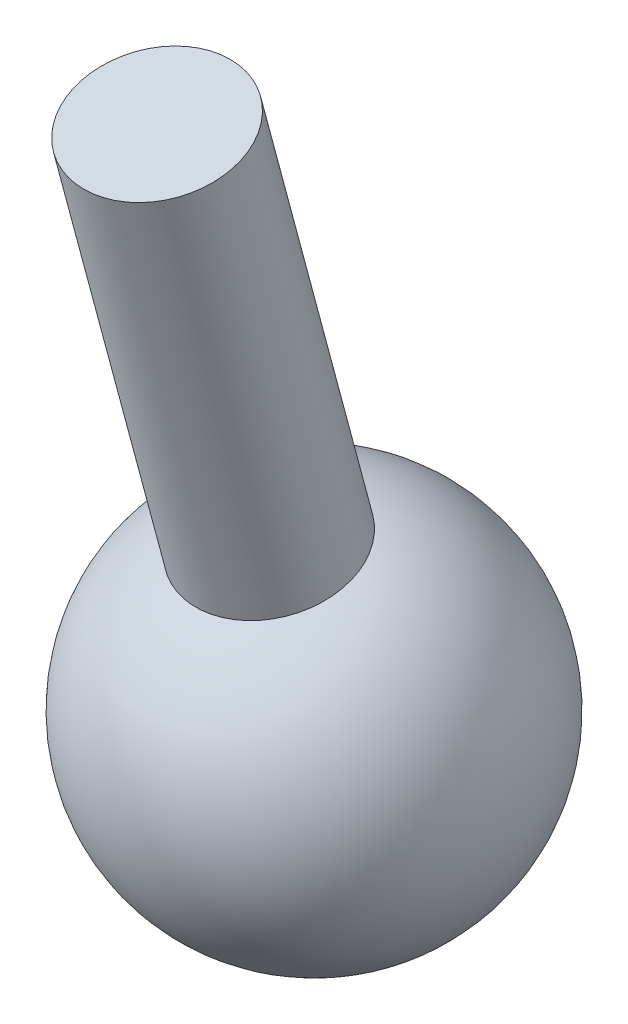
ISO-10303-21;
HEADER;
FILE_DESCRIPTION(('STEP AP214'),'2;1');
FILE_NAME('part.step','',(''),(''),'','','');
FILE_SCHEMA(('AUTOMOTIVE_DESIGN { 1 0 10303 214 1 1 1 1 }'));
ENDSEC;
DATA;
#1=APPLICATION_CONTEXT('core data for automotive mechanical design processes');
#2=APPLICATION_PROTOCOL_DEFINITION('international standard','automotive_design',2000,#1);
#3=PRODUCT_CONTEXT('',#1,'mechanical');
#4=PRODUCT('Part','Part','',(#3));
#5=PRODUCT_RELATED_PRODUCT_CATEGORY('part','',(#4));
#6=PRODUCT_DEFINITION_FORMATION('','',#4);
#7=PRODUCT_DEFINITION_CONTEXT('part definition',#1,'design');
#8=PRODUCT_DEFINITION('design','',#6,#7);
#9=PRODUCT_DEFINITION_SHAPE('','',#8);
#10=(LENGTH_UNIT() NAMED_UNIT(*) SI_UNIT(.MILLI.,.METRE.));
#11=(NAMED_UNIT(*) PLANE_ANGLE_UNIT() SI_UNIT($,.RADIAN.));
#12=(NAMED_UNIT(*) SI_UNIT($,.STERADIAN.) SOLID_ANGLE_UNIT());
#13=UNCERTAINTY_MEASURE_WITH_UNIT(LENGTH_MEASURE(1.E-05),#10,'distance_accuracy_value','');
#14=(GEOMETRIC_REPRESENTATION_CONTEXT(3) GLOBAL_UNCERTAINTY_ASSIGNED_CONTEXT((#13)) GLOBAL_UNIT_ASSIGNED_CONTEXT((#10,
#11,#12)) REPRESENTATION_CONTEXT('',''));
#15=CARTESIAN_POINT('',(0.,0.,0.));
#16=DIRECTION('',(0.,0.,1.));
#17=DIRECTION('',(1.,0.,0.));
#18=AXIS2_PLACEMENT_3D('',#15,#16,#17);
#19=CARTESIAN_POINT('',(176.349271453548,-303.905199402893,566.757258130841));
#20=DIRECTION('',(0.,-0.258819045102522,0.965925826289068));
#21=DIRECTION('',(-1.,0.,0.));
#22=AXIS2_PLACEMENT_3D('',#19,#20,#21);
#23=SPHERICAL_SURFACE('',#22,12.4999999999999);
#24=CARTESIAN_POINT('',(176.349271453548,-303.905199402893,566.757258130841));
#25=DIRECTION('',(0.,-0.965925826289068,-0.258819045102523));
#26=DIRECTION('',(0.,0.258819045102523,-0.965925826289068));
#27=AXIS2_PLACEMENT_3D('',#24,#25,#26);
#28=SPHERICAL_SURFACE('',#27,12.4999999999999);
#29=CARTESIAN_POINT('',(176.349271453548,-292.839128866187,569.722402794537));
#30=DIRECTION('',(0.,-0.96592582628907,-0.258819045102524));
#31=DIRECTION('',(0.,0.258819045102523,-0.965925826289068));
#32=AXIS2_PLACEMENT_3D('',#29,#30,#31);
#33=CIRCLE('',#32,5.00000000000001);
#34=CARTESIAN_POINT('',(176.349271453548,-291.545033640674,564.892773663092));
#35=VERTEX_POINT('',#34);
#36=EDGE_CURVE('E10',#35,#35,#33,.F.);
#37=ORIENTED_EDGE('',*,*,#36,.F.);
#38=EDGE_LOOP('',(#37));
#39=FACE_BOUND('',#38,.T.);
#40=ADVANCED_FACE('F40',(#39),#28,.T.);
#41=CARTESIAN_POINT('',(176.349271453548,-265.26816635133,577.110019934942));
#42=DIRECTION('',(0.,-0.965925826289068,-0.258819045102522));
#43=DIRECTION('',(0.,0.258819045102522,-0.965925826289068));
#44=AXIS2_PLACEMENT_3D('',#41,#42,#43);
#45=CYLINDRICAL_SURFACE('',#44,5.00000000000001);
#46=CARTESIAN_POINT('',(176.349271453548,-265.26816635133,577.110019934942));
#47=DIRECTION('',(0.,0.965925826289068,0.258819045102522));
#48=DIRECTION('',(0.,-0.258819045102522,0.965925826289068));
#49=AXIS2_PLACEMENT_3D('',#46,#47,#48);
#50=CIRCLE('',#49,5.00000000000001);
#51=CARTESIAN_POINT('',(176.349271453548,-266.562261576843,581.939649066387));
#52=VERTEX_POINT('',#51);
#53=EDGE_CURVE('E46',#52,#52,#50,.T.);
#54=ORIENTED_EDGE('',*,*,#53,.F.);
#55=EDGE_LOOP('',(#54));
#56=FACE_BOUND('',#55,.T.);
#57=ORIENTED_EDGE('',*,*,#36,.T.);
#58=EDGE_LOOP('',(#57));
#59=FACE_BOUND('',#58,.T.);
#60=ADVANCED_FACE('F54',(#56,#59),#45,.T.);
#61=CARTESIAN_POINT('',(176.349271453548,-265.26816635133,577.110019934942));
#62=DIRECTION('',(0.,0.965925826289068,0.258819045102522));
#63=DIRECTION('',(0.,-0.258819045102522,0.965925826289068));
#64=AXIS2_PLACEMENT_3D('',#61,#62,#63);
#65=PLANE('',#64);
#66=ORIENTED_EDGE('',*,*,#53,.T.);
#67=EDGE_LOOP('',(#66));
#68=FACE_BOUND('',#67,.T.);
#69=ADVANCED_FACE('F52',(#68),#65,.T.);
#70=CLOSED_SHELL('',(#40,#60,#69));
#71=MANIFOLD_SOLID_BREP('B2',#70);
#72=ADVANCED_BREP_SHAPE_REPRESENTATION('',(#18,#71),#14);
#73=SHAPE_DEFINITION_REPRESENTATION(#9,#72);
ENDSEC;
END-ISO-10303-21;
